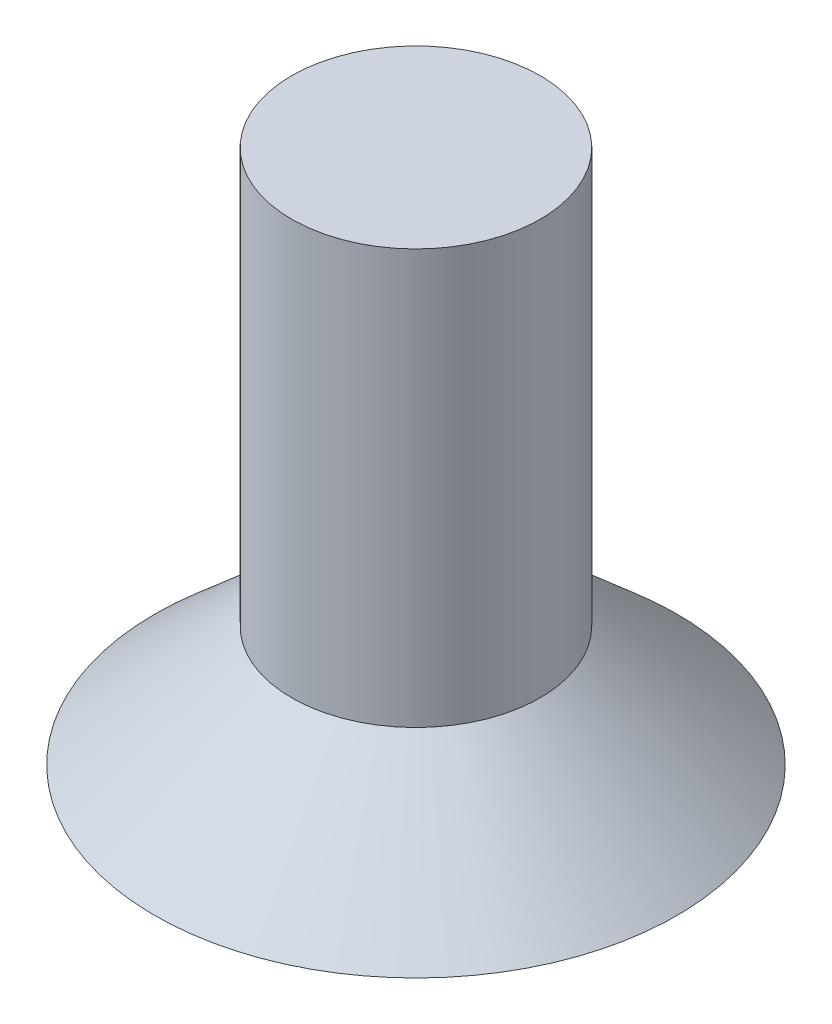
ISO-10303-21;
HEADER;
FILE_DESCRIPTION(('STEP AP214'),'2;1');
FILE_NAME('part.step','',(''),(''),'','','');
FILE_SCHEMA(('AUTOMOTIVE_DESIGN { 1 0 10303 214 1 1 1 1 }'));
ENDSEC;
DATA;
#1=APPLICATION_CONTEXT('core data for automotive mechanical design processes');
#2=APPLICATION_PROTOCOL_DEFINITION('international standard','automotive_design',2000,#1);
#3=PRODUCT_CONTEXT('',#1,'mechanical');
#4=PRODUCT('Part','Part','',(#3));
#5=PRODUCT_RELATED_PRODUCT_CATEGORY('part','',(#4));
#6=PRODUCT_DEFINITION_FORMATION('','',#4);
#7=PRODUCT_DEFINITION_CONTEXT('part definition',#1,'design');
#8=PRODUCT_DEFINITION('design','',#6,#7);
#9=PRODUCT_DEFINITION_SHAPE('','',#8);
#10=(LENGTH_UNIT() NAMED_UNIT(*) SI_UNIT(.MILLI.,.METRE.));
#11=(NAMED_UNIT(*) PLANE_ANGLE_UNIT() SI_UNIT($,.RADIAN.));
#12=(NAMED_UNIT(*) SI_UNIT($,.STERADIAN.) SOLID_ANGLE_UNIT());
#13=UNCERTAINTY_MEASURE_WITH_UNIT(LENGTH_MEASURE(1.E-05),#10,'distance_accuracy_value','');
#14=(GEOMETRIC_REPRESENTATION_CONTEXT(3) GLOBAL_UNCERTAINTY_ASSIGNED_CONTEXT((#13)) GLOBAL_UNIT_ASSIGNED_CONTEXT((#10,
#11,#12)) REPRESENTATION_CONTEXT('',''));
#15=CARTESIAN_POINT('',(0.,0.,0.));
#16=DIRECTION('',(0.,0.,1.));
#17=DIRECTION('',(1.,0.,0.));
#18=AXIS2_PLACEMENT_3D('',#15,#16,#17);
#19=CARTESIAN_POINT('',(0.,0.,0.));
#20=DIRECTION('',(0.,1.,0.));
#21=DIRECTION('',(-1.,0.,0.));
#22=AXIS2_PLACEMENT_3D('',#19,#20,#21);
#23=PLANE('',#22);
#24=CARTESIAN_POINT('',(0.,0.,0.));
#25=DIRECTION('',(0.,1.,0.));
#26=DIRECTION('',(-1.,0.,0.));
#27=AXIS2_PLACEMENT_3D('',#24,#25,#26);
#28=CIRCLE('',#27,3.15);
#29=CARTESIAN_POINT('',(-3.15,0.,0.));
#30=VERTEX_POINT('',#29);
#31=EDGE_CURVE('E10',#30,#30,#28,.T.);
#32=ORIENTED_EDGE('',*,*,#31,.F.);
#33=EDGE_LOOP('',(#32));
#34=FACE_BOUND('',#33,.T.);
#35=ADVANCED_FACE('F34',(#34),#23,.F.);
#36=CARTESIAN_POINT('',(0.,0.,0.));
#37=DIRECTION('',(0.,-1.,0.));
#38=DIRECTION('',(1.,0.,0.));
#39=AXIS2_PLACEMENT_3D('',#36,#37,#38);
#40=CONICAL_SURFACE('',#39,3.15,0.849825002823002);
#41=CARTESIAN_POINT('',(0.,1.45,0.));
#42=DIRECTION('',(0.,1.,0.));
#43=DIRECTION('',(-1.,0.,0.));
#44=AXIS2_PLACEMENT_3D('',#41,#42,#43);
#45=CIRCLE('',#44,1.5);
#46=CARTESIAN_POINT('',(-1.5,1.45,0.));
#47=VERTEX_POINT('',#46);
#48=EDGE_CURVE('E40',#47,#47,#45,.T.);
#49=ORIENTED_EDGE('',*,*,#48,.F.);
#50=EDGE_LOOP('',(#49));
#51=FACE_BOUND('',#50,.T.);
#52=ORIENTED_EDGE('',*,*,#31,.T.);
#53=EDGE_LOOP('',(#52));
#54=FACE_BOUND('',#53,.T.);
#55=ADVANCED_FACE('F55',(#51,#54),#40,.T.);
#56=CARTESIAN_POINT('',(0.,6.45,0.));
#57=DIRECTION('',(0.,1.,0.));
#58=DIRECTION('',(-1.,0.,0.));
#59=AXIS2_PLACEMENT_3D('',#56,#57,#58);
#60=CYLINDRICAL_SURFACE('',#59,1.5);
#61=CARTESIAN_POINT('',(0.,6.45,0.));
#62=DIRECTION('',(0.,1.,0.));
#63=DIRECTION('',(-1.,0.,0.));
#64=AXIS2_PLACEMENT_3D('',#61,#62,#63);
#65=CIRCLE('',#64,1.5);
#66=CARTESIAN_POINT('',(-1.5,6.45,0.));
#67=VERTEX_POINT('',#66);
#68=EDGE_CURVE('E44',#67,#67,#65,.T.);
#69=ORIENTED_EDGE('',*,*,#68,.F.);
#70=EDGE_LOOP('',(#69));
#71=FACE_BOUND('',#70,.T.);
#72=ORIENTED_EDGE('',*,*,#48,.T.);
#73=EDGE_LOOP('',(#72));
#74=FACE_BOUND('',#73,.T.);
#75=ADVANCED_FACE('F53',(#71,#74),#60,.T.);
#76=CARTESIAN_POINT('',(1.5,6.45,0.));
#77=DIRECTION('',(0.,-1.,0.));
#78=DIRECTION('',(1.,0.,0.));
#79=AXIS2_PLACEMENT_3D('',#76,#77,#78);
#80=PLANE('',#79);
#81=ORIENTED_EDGE('',*,*,#68,.T.);
#82=EDGE_LOOP('',(#81));
#83=FACE_BOUND('',#82,.T.);
#84=ADVANCED_FACE('F51',(#83),#80,.F.);
#85=CLOSED_SHELL('',(#35,#55,#75,#84));
#86=MANIFOLD_SOLID_BREP('B2',#85);
#87=ADVANCED_BREP_SHAPE_REPRESENTATION('',(#18,#86),#14);
#88=SHAPE_DEFINITION_REPRESENTATION(#9,#87);
ENDSEC;
END-ISO-10303-21;
